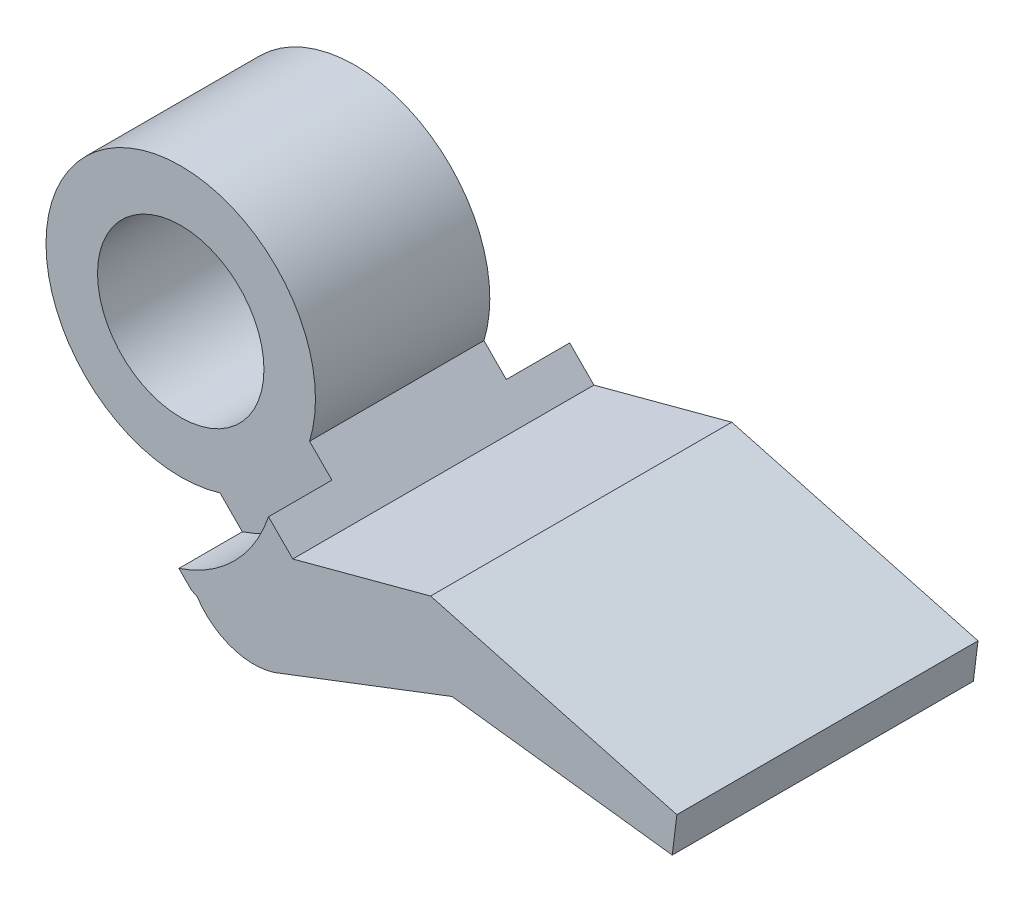
ISO-10303-21;
HEADER;
FILE_DESCRIPTION(('STEP AP214'),'2;1');
FILE_NAME('part.step','',(''),(''),'','','');
FILE_SCHEMA(('AUTOMOTIVE_DESIGN { 1 0 10303 214 1 1 1 1 }'));
ENDSEC;
DATA;
#1=APPLICATION_CONTEXT('core data for automotive mechanical design processes');
#2=APPLICATION_PROTOCOL_DEFINITION('international standard','automotive_design',2000,#1);
#3=PRODUCT_CONTEXT('',#1,'mechanical');
#4=PRODUCT('Part','Part','',(#3));
#5=PRODUCT_RELATED_PRODUCT_CATEGORY('part','',(#4));
#6=PRODUCT_DEFINITION_FORMATION('','',#4);
#7=PRODUCT_DEFINITION_CONTEXT('part definition',#1,'design');
#8=PRODUCT_DEFINITION('design','',#6,#7);
#9=PRODUCT_DEFINITION_SHAPE('','',#8);
#10=(LENGTH_UNIT() NAMED_UNIT(*) SI_UNIT(.MILLI.,.METRE.));
#11=(NAMED_UNIT(*) PLANE_ANGLE_UNIT() SI_UNIT($,.RADIAN.));
#12=(NAMED_UNIT(*) SI_UNIT($,.STERADIAN.) SOLID_ANGLE_UNIT());
#13=UNCERTAINTY_MEASURE_WITH_UNIT(LENGTH_MEASURE(1.E-05),#10,'distance_accuracy_value','');
#14=(GEOMETRIC_REPRESENTATION_CONTEXT(3) GLOBAL_UNCERTAINTY_ASSIGNED_CONTEXT((#13)) GLOBAL_UNIT_ASSIGNED_CONTEXT((#10,
#11,#12)) REPRESENTATION_CONTEXT('',''));
#15=CARTESIAN_POINT('',(0.,0.,0.));
#16=DIRECTION('',(0.,0.,1.));
#17=DIRECTION('',(1.,0.,0.));
#18=AXIS2_PLACEMENT_3D('',#15,#16,#17);
#19=CARTESIAN_POINT('',(-31.2629624497625,0.279933129899601,19.));
#20=DIRECTION('',(0.,0.,-1.));
#21=DIRECTION('',(-1.,0.,0.));
#22=AXIS2_PLACEMENT_3D('',#19,#20,#21);
#23=CYLINDRICAL_SURFACE('',#22,8.50000352692557);
#24=CARTESIAN_POINT('',(-31.2629624497625,0.279933129899601,4.));
#25=DIRECTION('',(0.,0.,-1.));
#26=DIRECTION('',(-1.,0.,0.));
#27=AXIS2_PLACEMENT_3D('',#24,#25,#26);
#28=CIRCLE('',#27,8.50000352692557);
#29=CARTESIAN_POINT('',(-28.7862315451445,-7.85123308312651,4.));
#30=VERTEX_POINT('',#29);
#31=CARTESIAN_POINT('',(-23.1333127941005,-2.20177121065812,4.));
#32=VERTEX_POINT('',#31);
#33=EDGE_CURVE('E276',#30,#32,#28,.T.);
#34=ORIENTED_EDGE('',*,*,#33,.F.);
#35=DIRECTION('',(0.,0.,-1.));
#36=VECTOR('',#35,1.);
#37=CARTESIAN_POINT('',(-28.7862315451445,-7.85123308312651,19.));
#38=LINE('',#37,#36);
#39=CARTESIAN_POINT('',(-28.7862315451445,-7.85123308312651,15.));
#40=VERTEX_POINT('',#39);
#41=EDGE_CURVE('E11',#40,#30,#38,.T.);
#42=ORIENTED_EDGE('',*,*,#41,.F.);
#43=CARTESIAN_POINT('',(-31.2629624497625,0.279933129899601,15.));
#44=DIRECTION('',(0.,0.,1.));
#45=DIRECTION('',(1.,0.,0.));
#46=AXIS2_PLACEMENT_3D('',#43,#44,#45);
#47=CIRCLE('',#46,8.50000352692557);
#48=CARTESIAN_POINT('',(-23.1333127941005,-2.20177121065812,15.));
#49=VERTEX_POINT('',#48);
#50=EDGE_CURVE('E263',#49,#40,#47,.T.);
#51=ORIENTED_EDGE('',*,*,#50,.F.);
#52=DIRECTION('',(0.,0.,-1.));
#53=VECTOR('',#52,1.);
#54=CARTESIAN_POINT('',(-23.1333127941005,-2.20177121065813,19.));
#55=LINE('',#54,#53);
#56=EDGE_CURVE('E144',#49,#32,#55,.T.);
#57=ORIENTED_EDGE('',*,*,#56,.T.);
#58=EDGE_LOOP('',(#34,#42,#51,#57));
#59=FACE_BOUND('',#58,.T.);
#60=ADVANCED_FACE('F41',(#59),#23,.T.);
#61=CARTESIAN_POINT('',(-31.2629624497625,0.279933129899601,19.));
#62=DIRECTION('',(0.,0.,-1.));
#63=DIRECTION('',(-1.,0.,0.));
#64=AXIS2_PLACEMENT_3D('',#61,#62,#63);
#65=CYLINDRICAL_SURFACE('',#64,5.25001082424248);
#66=CARTESIAN_POINT('',(-31.2629624497625,0.279933129899601,15.));
#67=DIRECTION('',(0.,0.,1.));
#68=DIRECTION('',(1.,0.,0.));
#69=AXIS2_PLACEMENT_3D('',#66,#67,#68);
#70=CIRCLE('',#69,5.25001082424248);
#71=CARTESIAN_POINT('',(-26.01295162552,0.279933129899601,15.));
#72=VERTEX_POINT('',#71);
#73=EDGE_CURVE('E149',#72,#72,#70,.T.);
#74=ORIENTED_EDGE('',*,*,#73,.T.);
#75=EDGE_LOOP('',(#74));
#76=FACE_BOUND('',#75,.T.);
#77=CARTESIAN_POINT('',(-31.2629624497625,0.279933129899601,4.));
#78=DIRECTION('',(0.,0.,-1.));
#79=DIRECTION('',(-1.,0.,0.));
#80=AXIS2_PLACEMENT_3D('',#77,#78,#79);
#81=CIRCLE('',#80,5.25001082424248);
#82=CARTESIAN_POINT('',(-36.5129732740049,0.279933129899601,4.));
#83=VERTEX_POINT('',#82);
#84=EDGE_CURVE('E271',#83,#83,#81,.T.);
#85=ORIENTED_EDGE('',*,*,#84,.T.);
#86=EDGE_LOOP('',(#85));
#87=FACE_BOUND('',#86,.T.);
#88=ADVANCED_FACE('F43',(#76,#87),#65,.F.);
#89=CARTESIAN_POINT('',(-18.416451756055,-18.2917229882688,19.));
#90=DIRECTION('',(-0.709505326226806,-0.704700072410805,0.));
#91=DIRECTION('',(0.704700072410805,-0.709505326226806,0.));
#92=AXIS2_PLACEMENT_3D('',#89,#90,#91);
#93=PLANE('',#92);
#94=DIRECTION('',(0.,0.,-1.));
#95=VECTOR('',#94,1.);
#96=CARTESIAN_POINT('',(-27.3768314003229,-9.27024373558013,4.));
#97=LINE('',#96,#95);
#98=CARTESIAN_POINT('',(-27.3768314003229,-9.27024373558013,4.));
#99=VERTEX_POINT('',#98);
#100=CARTESIAN_POINT('',(-27.3768314003229,-9.27024373558013,0.));
#101=VERTEX_POINT('',#100);
#102=EDGE_CURVE('E190',#99,#101,#97,.T.);
#103=ORIENTED_EDGE('',*,*,#102,.T.);
#104=DIRECTION('',(-0.704700072410805,0.709505326226805,0.));
#105=VECTOR('',#104,1.);
#106=CARTESIAN_POINT('',(-18.416451756055,-18.2917229882688,0.));
#107=LINE('',#106,#105);
#108=CARTESIAN_POINT('',(-26.5861436021061,-10.0663231262039,0.));
#109=VERTEX_POINT('',#108);
#110=EDGE_CURVE('E145',#109,#101,#107,.T.);
#111=ORIENTED_EDGE('',*,*,#110,.F.);
#112=DIRECTION('',(0.,0.,-1.));
#113=VECTOR('',#112,1.);
#114=CARTESIAN_POINT('',(-26.5861436021061,-10.0663231262039,19.));
#115=LINE('',#114,#113);
#116=CARTESIAN_POINT('',(-26.5861436021061,-10.0663231262039,19.));
#117=VERTEX_POINT('',#116);
#118=EDGE_CURVE('E50',#117,#109,#115,.T.);
#119=ORIENTED_EDGE('',*,*,#118,.F.);
#120=DIRECTION('',(-0.704700072410805,0.709505326226805,0.));
#121=VECTOR('',#120,1.);
#122=CARTESIAN_POINT('',(-18.416451756055,-18.2917229882688,19.));
#123=LINE('',#122,#121);
#124=CARTESIAN_POINT('',(-27.3768314003229,-9.27024373558012,19.));
#125=VERTEX_POINT('',#124);
#126=EDGE_CURVE('E167',#117,#125,#123,.T.);
#127=ORIENTED_EDGE('',*,*,#126,.T.);
#128=DIRECTION('',(0.,0.,1.));
#129=VECTOR('',#128,1.);
#130=CARTESIAN_POINT('',(-27.3768314003229,-9.27024373558012,15.));
#131=LINE('',#130,#129);
#132=CARTESIAN_POINT('',(-27.3768314003229,-9.27024373558012,15.));
#133=VERTEX_POINT('',#132);
#134=EDGE_CURVE('E268',#133,#125,#131,.T.);
#135=ORIENTED_EDGE('',*,*,#134,.F.);
#136=DIRECTION('',(0.704700072410804,-0.709505326226807,0.));
#137=VECTOR('',#136,1.);
#138=CARTESIAN_POINT('',(-28.7862315451445,-7.85123308312651,15.));
#139=LINE('',#138,#137);
#140=EDGE_CURVE('E444',#40,#133,#139,.T.);
#141=ORIENTED_EDGE('',*,*,#140,.F.);
#142=ORIENTED_EDGE('',*,*,#41,.T.);
#143=DIRECTION('',(-0.704700072410804,0.709505326226807,0.));
#144=VECTOR('',#143,1.);
#145=CARTESIAN_POINT('',(-28.7862315451445,-7.85123308312651,4.));
#146=LINE('',#145,#144);
#147=EDGE_CURVE('E252',#99,#30,#146,.T.);
#148=ORIENTED_EDGE('',*,*,#147,.F.);
#149=EDGE_LOOP('',(#103,#111,#119,#127,#135,#141,#142,#148));
#150=FACE_BOUND('',#149,.T.);
#151=ADVANCED_FACE('F186',(#150),#93,.T.);
#152=CARTESIAN_POINT('',(-8.62720040884361,-18.459557854721,19.));
#153=DIRECTION('',(-0.423398830434784,-0.905943392484573,0.));
#154=DIRECTION('',(0.905943392484573,-0.423398830434784,0.));
#155=AXIS2_PLACEMENT_3D('',#152,#153,#154);
#156=PLANE('',#155);
#157=DIRECTION('',(-0.905943392484573,0.423398830434784,0.));
#158=VECTOR('',#157,1.);
#159=CARTESIAN_POINT('',(-8.62720040884361,-18.459557854721,0.));
#160=LINE('',#159,#158);
#161=CARTESIAN_POINT('',(-26.2397690903874,-10.228203619368,0.));
#162=VERTEX_POINT('',#161);
#163=EDGE_CURVE('E148',#162,#109,#160,.T.);
#164=ORIENTED_EDGE('',*,*,#163,.F.);
#165=DIRECTION('',(0.,0.,-1.));
#166=VECTOR('',#165,1.);
#167=CARTESIAN_POINT('',(-26.2397690903874,-10.228203619368,19.));
#168=LINE('',#167,#166);
#169=CARTESIAN_POINT('',(-26.2397690903874,-10.228203619368,19.));
#170=VERTEX_POINT('',#169);
#171=EDGE_CURVE('E178',#170,#162,#168,.T.);
#172=ORIENTED_EDGE('',*,*,#171,.F.);
#173=DIRECTION('',(-0.905943392484573,0.423398830434784,0.));
#174=VECTOR('',#173,1.);
#175=CARTESIAN_POINT('',(-8.62720040884361,-18.459557854721,19.));
#176=LINE('',#175,#174);
#177=EDGE_CURVE('E184',#170,#117,#176,.T.);
#178=ORIENTED_EDGE('',*,*,#177,.T.);
#179=ORIENTED_EDGE('',*,*,#118,.T.);
#180=EDGE_LOOP('',(#164,#172,#178,#179));
#181=FACE_BOUND('',#180,.T.);
#182=ADVANCED_FACE('F182',(#181),#156,.T.);
#183=CARTESIAN_POINT('',(-22.6576379215174,-7.8512330831265,19.));
#184=DIRECTION('',(0.,0.,-1.));
#185=DIRECTION('',(-1.,0.,0.));
#186=AXIS2_PLACEMENT_3D('',#183,#184,#185);
#187=CYLINDRICAL_SURFACE('',#186,4.29902926730551);
#188=CARTESIAN_POINT('',(-22.6576379215174,-7.8512330831265,0.));
#189=DIRECTION('',(0.,0.,1.));
#190=DIRECTION('',(1.,0.,0.));
#191=AXIS2_PLACEMENT_3D('',#188,#189,#190);
#192=CIRCLE('',#191,4.29902926730551);
#193=CARTESIAN_POINT('',(-21.3544541489812,-11.9479835876297,0.));
#194=VERTEX_POINT('',#193);
#195=EDGE_CURVE('E152',#194,#162,#192,.F.);
#196=ORIENTED_EDGE('',*,*,#195,.F.);
#197=DIRECTION('',(0.,0.,-1.));
#198=VECTOR('',#197,1.);
#199=CARTESIAN_POINT('',(-21.3544541489812,-11.9479835876297,19.));
#200=LINE('',#199,#198);
#201=CARTESIAN_POINT('',(-21.3544541489812,-11.9479835876297,19.));
#202=VERTEX_POINT('',#201);
#203=EDGE_CURVE('E176',#202,#194,#200,.T.);
#204=ORIENTED_EDGE('',*,*,#203,.F.);
#205=CARTESIAN_POINT('',(-22.6576379215174,-7.8512330831265,19.));
#206=DIRECTION('',(0.,0.,1.));
#207=DIRECTION('',(1.,0.,0.));
#208=AXIS2_PLACEMENT_3D('',#205,#206,#207);
#209=CIRCLE('',#208,4.29902926730551);
#210=EDGE_CURVE('E200',#202,#170,#209,.F.);
#211=ORIENTED_EDGE('',*,*,#210,.T.);
#212=ORIENTED_EDGE('',*,*,#171,.T.);
#213=EDGE_LOOP('',(#196,#204,#211,#212));
#214=FACE_BOUND('',#213,.T.);
#215=ADVANCED_FACE('F197',(#214),#187,.T.);
#216=CARTESIAN_POINT('',(1.2594003366145,-3.2890929128034,19.));
#217=DIRECTION('',(0.357584800564061,-0.933880672466007,0.));
#218=DIRECTION('',(0.933880672466007,0.357584800564061,0.));
#219=AXIS2_PLACEMENT_3D('',#216,#217,#218);
#220=PLANE('',#219);
#221=DIRECTION('',(-0.933880672466007,-0.357584800564061,0.));
#222=VECTOR('',#221,1.);
#223=CARTESIAN_POINT('',(1.2594003366145,-3.2890929128034,0.));
#224=LINE('',#223,#222);
#225=CARTESIAN_POINT('',(-10.1479111802312,-7.65697559202423,0.));
#226=VERTEX_POINT('',#225);
#227=EDGE_CURVE('E155',#226,#194,#224,.T.);
#228=ORIENTED_EDGE('',*,*,#227,.F.);
#229=DIRECTION('',(0.,0.,-1.));
#230=VECTOR('',#229,1.);
#231=CARTESIAN_POINT('',(-10.1479111802312,-7.65697559202423,19.));
#232=LINE('',#231,#230);
#233=CARTESIAN_POINT('',(-10.1479111802312,-7.65697559202423,19.));
#234=VERTEX_POINT('',#233);
#235=EDGE_CURVE('E174',#234,#226,#232,.T.);
#236=ORIENTED_EDGE('',*,*,#235,.F.);
#237=DIRECTION('',(-0.933880672466007,-0.357584800564061,0.));
#238=VECTOR('',#237,1.);
#239=CARTESIAN_POINT('',(1.2594003366145,-3.2890929128034,19.));
#240=LINE('',#239,#238);
#241=EDGE_CURVE('E203',#234,#202,#240,.T.);
#242=ORIENTED_EDGE('',*,*,#241,.T.);
#243=ORIENTED_EDGE('',*,*,#203,.T.);
#244=EDGE_LOOP('',(#228,#236,#242,#243));
#245=FACE_BOUND('',#244,.T.);
#246=ADVANCED_FACE('F313',(#245),#220,.T.);
#247=CARTESIAN_POINT('',(-1.08520925135828,-8.77745200882767,19.));
#248=DIRECTION('',(-0.122701777375402,-0.992443587227464,0.));
#249=DIRECTION('',(0.992443587227464,-0.122701777375402,0.));
#250=AXIS2_PLACEMENT_3D('',#247,#248,#249);
#251=PLANE('',#250);
#252=DIRECTION('',(-0.992443587227464,0.122701777375402,0.));
#253=VECTOR('',#252,1.);
#254=CARTESIAN_POINT('',(-1.08520925135828,-8.77745200882767,0.));
#255=LINE('',#254,#253);
#256=CARTESIAN_POINT('',(3.74631489398758,-9.37480243528595,0.));
#257=VERTEX_POINT('',#256);
#258=EDGE_CURVE('E158',#257,#226,#255,.T.);
#259=ORIENTED_EDGE('',*,*,#258,.F.);
#260=DIRECTION('',(0.,0.,-1.));
#261=VECTOR('',#260,1.);
#262=CARTESIAN_POINT('',(3.74631489398758,-9.37480243528595,19.));
#263=LINE('',#262,#261);
#264=CARTESIAN_POINT('',(3.74631489398758,-9.37480243528595,19.));
#265=VERTEX_POINT('',#264);
#266=EDGE_CURVE('E134',#265,#257,#263,.T.);
#267=ORIENTED_EDGE('',*,*,#266,.F.);
#268=DIRECTION('',(-0.992443587227464,0.122701777375402,0.));
#269=VECTOR('',#268,1.);
#270=CARTESIAN_POINT('',(-1.08520925135828,-8.77745200882767,19.));
#271=LINE('',#270,#269);
#272=EDGE_CURVE('E127',#265,#234,#271,.T.);
#273=ORIENTED_EDGE('',*,*,#272,.T.);
#274=ORIENTED_EDGE('',*,*,#235,.T.);
#275=EDGE_LOOP('',(#259,#267,#273,#274));
#276=FACE_BOUND('',#275,.T.);
#277=ADVANCED_FACE('F210',(#276),#251,.T.);
#278=CARTESIAN_POINT('',(4.83162294742946,-0.597421892619307,19.));
#279=DIRECTION('',(-0.992442105107806,0.122713764546556,0.));
#280=DIRECTION('',(-0.122713764546556,-0.992442105107806,0.));
#281=AXIS2_PLACEMENT_3D('',#278,#279,#280);
#282=PLANE('',#281);
#283=DIRECTION('',(0.122713764546556,0.992442105107806,0.));
#284=VECTOR('',#283,1.);
#285=CARTESIAN_POINT('',(4.83162294742946,-0.597421892619307,0.));
#286=LINE('',#285,#284);
#287=CARTESIAN_POINT('',(4.03751362445637,-7.01974567259064,0.));
#288=VERTEX_POINT('',#287);
#289=EDGE_CURVE('E133',#257,#288,#286,.T.);
#290=ORIENTED_EDGE('',*,*,#289,.T.);
#291=DIRECTION('',(0.,0.,-1.));
#292=VECTOR('',#291,1.);
#293=CARTESIAN_POINT('',(4.03751362445637,-7.01974567259064,19.));
#294=LINE('',#293,#292);
#295=CARTESIAN_POINT('',(4.03751362445637,-7.01974567259064,19.));
#296=VERTEX_POINT('',#295);
#297=EDGE_CURVE('E130',#296,#288,#294,.T.);
#298=ORIENTED_EDGE('',*,*,#297,.F.);
#299=DIRECTION('',(0.122713764546556,0.992442105107806,0.));
#300=VECTOR('',#299,1.);
#301=CARTESIAN_POINT('',(4.83162294742946,-0.597421892619307,19.));
#302=LINE('',#301,#300);
#303=EDGE_CURVE('E119',#265,#296,#302,.T.);
#304=ORIENTED_EDGE('',*,*,#303,.F.);
#305=ORIENTED_EDGE('',*,*,#266,.T.);
#306=EDGE_LOOP('',(#290,#298,#304,#305));
#307=FACE_BOUND('',#306,.T.);
#308=ADVANCED_FACE('F131',(#307),#282,.F.);
#309=CARTESIAN_POINT('',(-1.48787529844271,-5.5342536389837,19.));
#310=DIRECTION('',(-0.259629166594158,-0.965708390692358,0.));
#311=DIRECTION('',(0.965708390692358,-0.259629166594158,0.));
#312=AXIS2_PLACEMENT_3D('',#309,#310,#311);
#313=PLANE('',#312);
#314=DIRECTION('',(-0.965708390692358,0.259629166594158,0.));
#315=VECTOR('',#314,1.);
#316=CARTESIAN_POINT('',(-1.48787529844271,-5.5342536389837,0.));
#317=LINE('',#316,#315);
#318=CARTESIAN_POINT('',(-11.4986191880436,-2.8428810485672,0.));
#319=VERTEX_POINT('',#318);
#320=EDGE_CURVE('E88',#288,#319,#317,.T.);
#321=ORIENTED_EDGE('',*,*,#320,.T.);
#322=DIRECTION('',(0.,0.,-1.));
#323=VECTOR('',#322,1.);
#324=CARTESIAN_POINT('',(-11.4986191880436,-2.8428810485672,19.));
#325=LINE('',#324,#323);
#326=CARTESIAN_POINT('',(-11.4986191880436,-2.8428810485672,19.));
#327=VERTEX_POINT('',#326);
#328=EDGE_CURVE('E135',#327,#319,#325,.T.);
#329=ORIENTED_EDGE('',*,*,#328,.F.);
#330=DIRECTION('',(-0.965708390692358,0.259629166594158,0.));
#331=VECTOR('',#330,1.);
#332=CARTESIAN_POINT('',(-1.48787529844271,-5.5342536389837,19.));
#333=LINE('',#332,#331);
#334=EDGE_CURVE('E124',#296,#327,#333,.T.);
#335=ORIENTED_EDGE('',*,*,#334,.F.);
#336=ORIENTED_EDGE('',*,*,#297,.T.);
#337=EDGE_LOOP('',(#321,#329,#335,#336));
#338=FACE_BOUND('',#337,.T.);
#339=ADVANCED_FACE('F137',(#338),#313,.F.);
#340=CARTESIAN_POINT('',(-0.0567877391532174,0.21264910111346,19.));
#341=DIRECTION('',(0.258007538714755,-0.966142903491173,0.));
#342=DIRECTION('',(0.966142903491173,0.258007538714755,0.));
#343=AXIS2_PLACEMENT_3D('',#340,#341,#342);
#344=PLANE('',#343);
#345=DIRECTION('',(-0.966142903491173,-0.258007538714755,0.));
#346=VECTOR('',#345,1.);
#347=CARTESIAN_POINT('',(-0.0567877391532174,0.21264910111346,0.));
#348=LINE('',#347,#346);
#349=CARTESIAN_POINT('',(-20.1939316880436,-5.16495593870392,0.));
#350=VERTEX_POINT('',#349);
#351=EDGE_CURVE('E94',#319,#350,#348,.T.);
#352=ORIENTED_EDGE('',*,*,#351,.T.);
#353=DIRECTION('',(0.,0.,-1.));
#354=VECTOR('',#353,1.);
#355=CARTESIAN_POINT('',(-20.1939316880436,-5.16495593870392,19.));
#356=LINE('',#355,#354);
#357=CARTESIAN_POINT('',(-20.1939316880436,-5.16495593870392,19.));
#358=VERTEX_POINT('',#357);
#359=EDGE_CURVE('E170',#358,#350,#356,.T.);
#360=ORIENTED_EDGE('',*,*,#359,.F.);
#361=DIRECTION('',(-0.966142903491173,-0.258007538714755,0.));
#362=VECTOR('',#361,1.);
#363=CARTESIAN_POINT('',(-0.0567877391532174,0.21264910111346,19.));
#364=LINE('',#363,#362);
#365=EDGE_CURVE('E58',#327,#358,#364,.T.);
#366=ORIENTED_EDGE('',*,*,#365,.F.);
#367=ORIENTED_EDGE('',*,*,#328,.T.);
#368=EDGE_LOOP('',(#352,#360,#366,#367));
#369=FACE_BOUND('',#368,.T.);
#370=ADVANCED_FACE('F323',(#369),#344,.F.);
#371=CARTESIAN_POINT('',(-12.7607957397129,-12.6582867212266,19.));
#372=DIRECTION('',(-0.709952598996936,-0.704249463739587,0.));
#373=DIRECTION('',(0.704249463739587,-0.709952598996936,0.));
#374=AXIS2_PLACEMENT_3D('',#371,#372,#373);
#375=PLANE('',#374);
#376=DIRECTION('',(-0.704249463739587,0.709952598996936,0.));
#377=VECTOR('',#376,1.);
#378=CARTESIAN_POINT('',(-12.7607957397129,-12.6582867212266,0.));
#379=LINE('',#378,#377);
#380=CARTESIAN_POINT('',(-21.723257046392,-3.62324583628368,0.));
#381=VERTEX_POINT('',#380);
#382=EDGE_CURVE('E164',#350,#381,#379,.T.);
#383=ORIENTED_EDGE('',*,*,#382,.T.);
#384=DIRECTION('',(0.,0.,-1.));
#385=VECTOR('',#384,1.);
#386=CARTESIAN_POINT('',(-21.723257046392,-3.62324583628368,4.));
#387=LINE('',#386,#385);
#388=CARTESIAN_POINT('',(-21.723257046392,-3.62324583628368,4.));
#389=VERTEX_POINT('',#388);
#390=EDGE_CURVE('E221',#381,#389,#387,.F.);
#391=ORIENTED_EDGE('',*,*,#390,.T.);
#392=DIRECTION('',(0.704249463739587,-0.709952598996936,0.));
#393=VECTOR('',#392,1.);
#394=CARTESIAN_POINT('',(-12.7607957397129,-12.6582867212266,4.));
#395=LINE('',#394,#393);
#396=EDGE_CURVE('E273',#32,#389,#395,.T.);
#397=ORIENTED_EDGE('',*,*,#396,.F.);
#398=ORIENTED_EDGE('',*,*,#56,.F.);
#399=DIRECTION('',(-0.704249463739587,0.709952598996936,0.));
#400=VECTOR('',#399,1.);
#401=CARTESIAN_POINT('',(-23.1333127941005,-2.20177121065812,15.));
#402=LINE('',#401,#400);
#403=CARTESIAN_POINT('',(-21.7248138666214,-3.621676408652,15.));
#404=VERTEX_POINT('',#403);
#405=EDGE_CURVE('E259',#404,#49,#402,.T.);
#406=ORIENTED_EDGE('',*,*,#405,.F.);
#407=DIRECTION('',(0.,0.,1.));
#408=VECTOR('',#407,1.);
#409=CARTESIAN_POINT('',(-21.7248138666214,-3.621676408652,15.));
#410=LINE('',#409,#408);
#411=CARTESIAN_POINT('',(-21.7248138666214,-3.621676408652,19.));
#412=VERTEX_POINT('',#411);
#413=EDGE_CURVE('E278',#404,#412,#410,.T.);
#414=ORIENTED_EDGE('',*,*,#413,.T.);
#415=DIRECTION('',(-0.704249463739587,0.709952598996936,0.));
#416=VECTOR('',#415,1.);
#417=CARTESIAN_POINT('',(-12.7607957397129,-12.6582867212266,19.));
#418=LINE('',#417,#416);
#419=EDGE_CURVE('E139',#358,#412,#418,.T.);
#420=ORIENTED_EDGE('',*,*,#419,.F.);
#421=ORIENTED_EDGE('',*,*,#359,.T.);
#422=EDGE_LOOP('',(#383,#391,#397,#398,#406,#414,#420,#421));
#423=FACE_BOUND('',#422,.T.);
#424=ADVANCED_FACE('F217',(#423),#375,.F.);
#425=CARTESIAN_POINT('',(0.,0.,19.));
#426=DIRECTION('',(0.,0.,1.));
#427=DIRECTION('',(1.,0.,0.));
#428=AXIS2_PLACEMENT_3D('',#425,#426,#427);
#429=PLANE('',#428);
#430=CARTESIAN_POINT('',(-30.1779893167957,-0.815356253766533,19.));
#431=DIRECTION('',(0.,0.,1.));
#432=DIRECTION('',(1.,0.,0.));
#433=AXIS2_PLACEMENT_3D('',#430,#431,#432);
#434=CIRCLE('',#433,8.90682929010916);
#435=EDGE_CURVE('E442',#125,#412,#434,.T.);
#436=ORIENTED_EDGE('',*,*,#435,.F.);
#437=ORIENTED_EDGE('',*,*,#126,.F.);
#438=ORIENTED_EDGE('',*,*,#177,.F.);
#439=ORIENTED_EDGE('',*,*,#210,.F.);
#440=ORIENTED_EDGE('',*,*,#241,.F.);
#441=ORIENTED_EDGE('',*,*,#272,.F.);
#442=ORIENTED_EDGE('',*,*,#303,.T.);
#443=ORIENTED_EDGE('',*,*,#334,.T.);
#444=ORIENTED_EDGE('',*,*,#365,.T.);
#445=ORIENTED_EDGE('',*,*,#419,.T.);
#446=EDGE_LOOP('',(#436,#437,#438,#439,#440,#441,#442,#443,#444,#445));
#447=FACE_BOUND('',#446,.T.);
#448=ADVANCED_FACE('F122',(#447),#429,.T.);
#449=CARTESIAN_POINT('',(0.,0.,0.));
#450=DIRECTION('',(0.,0.,1.));
#451=DIRECTION('',(1.,0.,0.));
#452=AXIS2_PLACEMENT_3D('',#449,#450,#451);
#453=PLANE('',#452);
#454=ORIENTED_EDGE('',*,*,#110,.T.);
#455=CARTESIAN_POINT('',(-34.926949888714,3.94224575187741,0.));
#456=DIRECTION('',(0.,0.,-1.));
#457=DIRECTION('',(-1.,0.,0.));
#458=AXIS2_PLACEMENT_3D('',#455,#456,#457);
#459=CIRCLE('',#458,15.2175611595591);
#460=EDGE_CURVE('E214',#381,#101,#459,.T.);
#461=ORIENTED_EDGE('',*,*,#460,.F.);
#462=ORIENTED_EDGE('',*,*,#382,.F.);
#463=ORIENTED_EDGE('',*,*,#351,.F.);
#464=ORIENTED_EDGE('',*,*,#320,.F.);
#465=ORIENTED_EDGE('',*,*,#289,.F.);
#466=ORIENTED_EDGE('',*,*,#258,.T.);
#467=ORIENTED_EDGE('',*,*,#227,.T.);
#468=ORIENTED_EDGE('',*,*,#195,.T.);
#469=ORIENTED_EDGE('',*,*,#163,.T.);
#470=EDGE_LOOP('',(#454,#461,#462,#463,#464,#465,#466,#467,#468,#469));
#471=FACE_BOUND('',#470,.T.);
#472=ADVANCED_FACE('F193',(#471),#453,.F.);
#473=CARTESIAN_POINT('',(-31.2629624497625,0.279933129899601,15.));
#474=DIRECTION('',(0.,0.,1.));
#475=DIRECTION('',(1.,0.,0.));
#476=AXIS2_PLACEMENT_3D('',#473,#474,#475);
#477=PLANE('',#476);
#478=ORIENTED_EDGE('',*,*,#73,.F.);
#479=EDGE_LOOP('',(#478));
#480=FACE_BOUND('',#479,.T.);
#481=ORIENTED_EDGE('',*,*,#50,.T.);
#482=ORIENTED_EDGE('',*,*,#140,.T.);
#483=CARTESIAN_POINT('',(-30.1779893167957,-0.815356253766533,15.));
#484=DIRECTION('',(0.,0.,1.));
#485=DIRECTION('',(1.,0.,0.));
#486=AXIS2_PLACEMENT_3D('',#483,#484,#485);
#487=CIRCLE('',#486,8.90682929010916);
#488=EDGE_CURVE('E265',#133,#404,#487,.T.);
#489=ORIENTED_EDGE('',*,*,#488,.T.);
#490=ORIENTED_EDGE('',*,*,#405,.T.);
#491=EDGE_LOOP('',(#481,#482,#489,#490));
#492=FACE_BOUND('',#491,.T.);
#493=ADVANCED_FACE('F261',(#480,#492),#477,.T.);
#494=CARTESIAN_POINT('',(-31.2629624497625,0.279933129899601,4.));
#495=DIRECTION('',(0.,0.,-1.));
#496=DIRECTION('',(-1.,0.,0.));
#497=AXIS2_PLACEMENT_3D('',#494,#495,#496);
#498=PLANE('',#497);
#499=ORIENTED_EDGE('',*,*,#84,.F.);
#500=EDGE_LOOP('',(#499));
#501=FACE_BOUND('',#500,.T.);
#502=ORIENTED_EDGE('',*,*,#33,.T.);
#503=ORIENTED_EDGE('',*,*,#396,.T.);
#504=CARTESIAN_POINT('',(-34.926949888714,3.94224575187741,4.));
#505=DIRECTION('',(0.,0.,-1.));
#506=DIRECTION('',(-1.,0.,0.));
#507=AXIS2_PLACEMENT_3D('',#504,#505,#506);
#508=CIRCLE('',#507,15.2175611595591);
#509=EDGE_CURVE('E452',#389,#99,#508,.T.);
#510=ORIENTED_EDGE('',*,*,#509,.T.);
#511=ORIENTED_EDGE('',*,*,#147,.T.);
#512=EDGE_LOOP('',(#502,#503,#510,#511));
#513=FACE_BOUND('',#512,.T.);
#514=ADVANCED_FACE('F277',(#501,#513),#498,.T.);
#515=CARTESIAN_POINT('',(-30.1779893167957,-0.815356253766533,15.));
#516=DIRECTION('',(0.,0.,1.));
#517=DIRECTION('',(1.,0.,0.));
#518=AXIS2_PLACEMENT_3D('',#515,#516,#517);
#519=CYLINDRICAL_SURFACE('',#518,8.90682929010916);
#520=ORIENTED_EDGE('',*,*,#435,.T.);
#521=ORIENTED_EDGE('',*,*,#413,.F.);
#522=ORIENTED_EDGE('',*,*,#488,.F.);
#523=ORIENTED_EDGE('',*,*,#134,.T.);
#524=EDGE_LOOP('',(#520,#521,#522,#523));
#525=FACE_BOUND('',#524,.T.);
#526=ADVANCED_FACE('F296',(#525),#519,.F.);
#527=CARTESIAN_POINT('',(-34.926949888714,3.94224575187741,4.));
#528=DIRECTION('',(0.,0.,-1.));
#529=DIRECTION('',(-1.,0.,0.));
#530=AXIS2_PLACEMENT_3D('',#527,#528,#529);
#531=CYLINDRICAL_SURFACE('',#530,15.2175611595591);
#532=ORIENTED_EDGE('',*,*,#460,.T.);
#533=ORIENTED_EDGE('',*,*,#102,.F.);
#534=ORIENTED_EDGE('',*,*,#509,.F.);
#535=ORIENTED_EDGE('',*,*,#390,.F.);
#536=EDGE_LOOP('',(#532,#533,#534,#535));
#537=FACE_BOUND('',#536,.T.);
#538=ADVANCED_FACE('F398',(#537),#531,.F.);
#539=CLOSED_SHELL('',(#60,#88,#151,#182,#215,#246,#277,#308,#339,#370,#424,#448,#472,#493,#514,
#526,#538));
#540=MANIFOLD_SOLID_BREP('B2',#539);
#541=ADVANCED_BREP_SHAPE_REPRESENTATION('',(#18,#540),#14);
#542=SHAPE_DEFINITION_REPRESENTATION(#9,#541);
ENDSEC;
END-ISO-10303-21;
